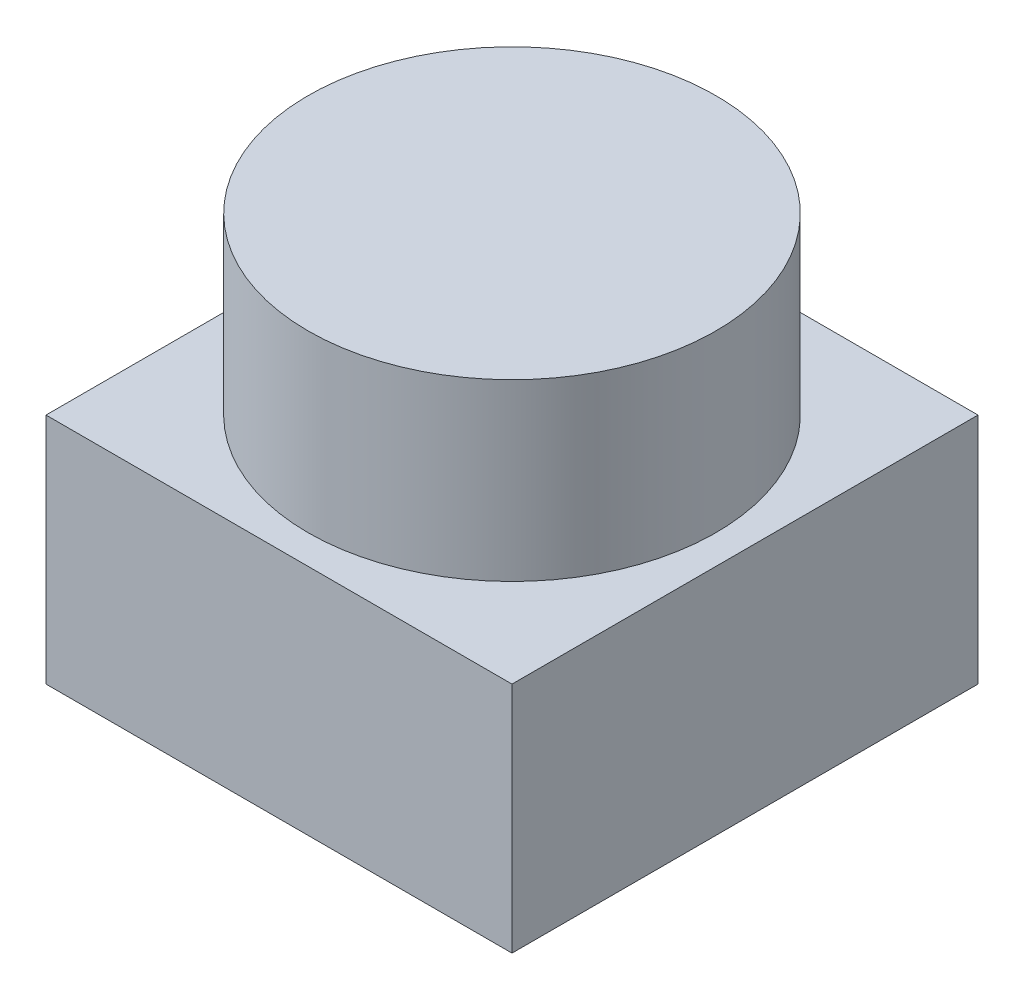
ISO-10303-21;
HEADER;
FILE_DESCRIPTION(('STEP AP214'),'2;1');
FILE_NAME('part.step','',(''),(''),'','','');
FILE_SCHEMA(('AUTOMOTIVE_DESIGN { 1 0 10303 214 1 1 1 1 }'));
ENDSEC;
DATA;
#1=APPLICATION_CONTEXT('core data for automotive mechanical design processes');
#2=APPLICATION_PROTOCOL_DEFINITION('international standard','automotive_design',2000,#1);
#3=PRODUCT_CONTEXT('',#1,'mechanical');
#4=PRODUCT('Part','Part','',(#3));
#5=PRODUCT_RELATED_PRODUCT_CATEGORY('part','',(#4));
#6=PRODUCT_DEFINITION_FORMATION('','',#4);
#7=PRODUCT_DEFINITION_CONTEXT('part definition',#1,'design');
#8=PRODUCT_DEFINITION('design','',#6,#7);
#9=PRODUCT_DEFINITION_SHAPE('','',#8);
#10=(LENGTH_UNIT() NAMED_UNIT(*) SI_UNIT(.MILLI.,.METRE.));
#11=(NAMED_UNIT(*) PLANE_ANGLE_UNIT() SI_UNIT($,.RADIAN.));
#12=(NAMED_UNIT(*) SI_UNIT($,.STERADIAN.) SOLID_ANGLE_UNIT());
#13=UNCERTAINTY_MEASURE_WITH_UNIT(LENGTH_MEASURE(1.E-05),#10,'distance_accuracy_value','');
#14=(GEOMETRIC_REPRESENTATION_CONTEXT(3) GLOBAL_UNCERTAINTY_ASSIGNED_CONTEXT((#13)) GLOBAL_UNIT_ASSIGNED_CONTEXT((#10,
#11,#12)) REPRESENTATION_CONTEXT('',''));
#15=CARTESIAN_POINT('',(0.,0.,0.));
#16=DIRECTION('',(0.,0.,1.));
#17=DIRECTION('',(1.,0.,0.));
#18=AXIS2_PLACEMENT_3D('',#15,#16,#17);
#19=CARTESIAN_POINT('',(-17.9816513761468,20.,-22.2018348623852));
#20=DIRECTION('',(1.,0.,0.));
#21=DIRECTION('',(0.,0.,-1.));
#22=AXIS2_PLACEMENT_3D('',#19,#20,#21);
#23=PLANE('',#22);
#24=DIRECTION('',(0.,0.,1.));
#25=VECTOR('',#24,1.);
#26=CARTESIAN_POINT('',(-17.9816513761468,0.,-22.2018348623852));
#27=LINE('',#26,#25);
#28=CARTESIAN_POINT('',(-17.9816513761468,0.,-22.2018348623852));
#29=VERTEX_POINT('',#28);
#30=CARTESIAN_POINT('',(-17.9816513761468,0.,17.7981651376148));
#31=VERTEX_POINT('',#30);
#32=EDGE_CURVE('E109',#29,#31,#27,.T.);
#33=ORIENTED_EDGE('',*,*,#32,.T.);
#34=DIRECTION('',(0.,-1.,0.));
#35=VECTOR('',#34,1.);
#36=CARTESIAN_POINT('',(-17.9816513761468,20.,17.7981651376148));
#37=LINE('',#36,#35);
#38=CARTESIAN_POINT('',(-17.9816513761468,20.,17.7981651376148));
#39=VERTEX_POINT('',#38);
#40=EDGE_CURVE('E46',#39,#31,#37,.T.);
#41=ORIENTED_EDGE('',*,*,#40,.F.);
#42=DIRECTION('',(0.,0.,1.));
#43=VECTOR('',#42,1.);
#44=CARTESIAN_POINT('',(-17.9816513761468,20.,-22.2018348623852));
#45=LINE('',#44,#43);
#46=CARTESIAN_POINT('',(-17.9816513761468,20.,-22.2018348623852));
#47=VERTEX_POINT('',#46);
#48=EDGE_CURVE('E96',#47,#39,#45,.T.);
#49=ORIENTED_EDGE('',*,*,#48,.F.);
#50=DIRECTION('',(0.,-1.,0.));
#51=VECTOR('',#50,1.);
#52=CARTESIAN_POINT('',(-17.9816513761468,20.,-22.2018348623852));
#53=LINE('',#52,#51);
#54=EDGE_CURVE('E105',#47,#29,#53,.T.);
#55=ORIENTED_EDGE('',*,*,#54,.T.);
#56=EDGE_LOOP('',(#33,#41,#49,#55));
#57=FACE_BOUND('',#56,.T.);
#58=ADVANCED_FACE('F43',(#57),#23,.F.);
#59=CARTESIAN_POINT('',(-17.9816513761468,20.,17.7981651376148));
#60=DIRECTION('',(0.,0.,-1.));
#61=DIRECTION('',(-1.,0.,0.));
#62=AXIS2_PLACEMENT_3D('',#59,#60,#61);
#63=PLANE('',#62);
#64=DIRECTION('',(1.,0.,0.));
#65=VECTOR('',#64,1.);
#66=CARTESIAN_POINT('',(-17.9816513761468,0.,17.7981651376148));
#67=LINE('',#66,#65);
#68=CARTESIAN_POINT('',(22.0183486238532,0.,17.7981651376148));
#69=VERTEX_POINT('',#68);
#70=EDGE_CURVE('E101',#31,#69,#67,.T.);
#71=ORIENTED_EDGE('',*,*,#70,.T.);
#72=DIRECTION('',(0.,-1.,0.));
#73=VECTOR('',#72,1.);
#74=CARTESIAN_POINT('',(22.0183486238532,20.,17.7981651376148));
#75=LINE('',#74,#73);
#76=CARTESIAN_POINT('',(22.0183486238532,20.,17.7981651376148));
#77=VERTEX_POINT('',#76);
#78=EDGE_CURVE('E99',#77,#69,#75,.T.);
#79=ORIENTED_EDGE('',*,*,#78,.F.);
#80=DIRECTION('',(1.,0.,0.));
#81=VECTOR('',#80,1.);
#82=CARTESIAN_POINT('',(-17.9816513761468,20.,17.7981651376148));
#83=LINE('',#82,#81);
#84=EDGE_CURVE('E91',#39,#77,#83,.T.);
#85=ORIENTED_EDGE('',*,*,#84,.F.);
#86=ORIENTED_EDGE('',*,*,#40,.T.);
#87=EDGE_LOOP('',(#71,#79,#85,#86));
#88=FACE_BOUND('',#87,.T.);
#89=ADVANCED_FACE('F100',(#88),#63,.F.);
#90=CARTESIAN_POINT('',(22.0183486238532,20.,-22.2018348623852));
#91=DIRECTION('',(-1.,0.,0.));
#92=DIRECTION('',(0.,0.,1.));
#93=AXIS2_PLACEMENT_3D('',#90,#91,#92);
#94=PLANE('',#93);
#95=DIRECTION('',(0.,0.,-1.));
#96=VECTOR('',#95,1.);
#97=CARTESIAN_POINT('',(22.0183486238532,0.,-22.2018348623852));
#98=LINE('',#97,#96);
#99=CARTESIAN_POINT('',(22.0183486238532,0.,-22.2018348623852));
#100=VERTEX_POINT('',#99);
#101=EDGE_CURVE('E77',#69,#100,#98,.T.);
#102=ORIENTED_EDGE('',*,*,#101,.T.);
#103=DIRECTION('',(0.,-1.,0.));
#104=VECTOR('',#103,1.);
#105=CARTESIAN_POINT('',(22.0183486238532,20.,-22.2018348623852));
#106=LINE('',#105,#104);
#107=CARTESIAN_POINT('',(22.0183486238532,20.,-22.2018348623852));
#108=VERTEX_POINT('',#107);
#109=EDGE_CURVE('E102',#108,#100,#106,.T.);
#110=ORIENTED_EDGE('',*,*,#109,.F.);
#111=DIRECTION('',(0.,0.,-1.));
#112=VECTOR('',#111,1.);
#113=CARTESIAN_POINT('',(22.0183486238532,20.,-22.2018348623852));
#114=LINE('',#113,#112);
#115=EDGE_CURVE('E94',#77,#108,#114,.T.);
#116=ORIENTED_EDGE('',*,*,#115,.F.);
#117=ORIENTED_EDGE('',*,*,#78,.T.);
#118=EDGE_LOOP('',(#102,#110,#116,#117));
#119=FACE_BOUND('',#118,.T.);
#120=ADVANCED_FACE('F103',(#119),#94,.F.);
#121=CARTESIAN_POINT('',(-17.9816513761468,20.,-22.2018348623852));
#122=DIRECTION('',(0.,0.,1.));
#123=DIRECTION('',(1.,0.,0.));
#124=AXIS2_PLACEMENT_3D('',#121,#122,#123);
#125=PLANE('',#124);
#126=DIRECTION('',(-1.,0.,0.));
#127=VECTOR('',#126,1.);
#128=CARTESIAN_POINT('',(-17.9816513761468,0.,-22.2018348623852));
#129=LINE('',#128,#127);
#130=EDGE_CURVE('E83',#100,#29,#129,.T.);
#131=ORIENTED_EDGE('',*,*,#130,.T.);
#132=ORIENTED_EDGE('',*,*,#54,.F.);
#133=DIRECTION('',(-1.,0.,0.));
#134=VECTOR('',#133,1.);
#135=CARTESIAN_POINT('',(-17.9816513761468,20.,-22.2018348623852));
#136=LINE('',#135,#134);
#137=EDGE_CURVE('E60',#108,#47,#136,.T.);
#138=ORIENTED_EDGE('',*,*,#137,.F.);
#139=ORIENTED_EDGE('',*,*,#109,.T.);
#140=EDGE_LOOP('',(#131,#132,#138,#139));
#141=FACE_BOUND('',#140,.T.);
#142=ADVANCED_FACE('F117',(#141),#125,.F.);
#143=CARTESIAN_POINT('',(0.,20.,0.));
#144=DIRECTION('',(0.,1.,0.));
#145=DIRECTION('',(0.,0.,1.));
#146=AXIS2_PLACEMENT_3D('',#143,#144,#145);
#147=PLANE('',#146);
#148=CARTESIAN_POINT('',(2.01834862385319,20.,-2.2018348623852));
#149=DIRECTION('',(0.,1.,0.));
#150=DIRECTION('',(0.,0.,1.));
#151=AXIS2_PLACEMENT_3D('',#148,#149,#150);
#152=CIRCLE('',#151,17.5);
#153=CARTESIAN_POINT('',(2.01834862385319,20.,15.2981651376148));
#154=VERTEX_POINT('',#153);
#155=EDGE_CURVE('E11',#154,#154,#152,.T.);
#156=ORIENTED_EDGE('',*,*,#155,.F.);
#157=EDGE_LOOP('',(#156));
#158=FACE_BOUND('',#157,.T.);
#159=ORIENTED_EDGE('',*,*,#48,.T.);
#160=ORIENTED_EDGE('',*,*,#84,.T.);
#161=ORIENTED_EDGE('',*,*,#115,.T.);
#162=ORIENTED_EDGE('',*,*,#137,.T.);
#163=EDGE_LOOP('',(#159,#160,#161,#162));
#164=FACE_BOUND('',#163,.T.);
#165=ADVANCED_FACE('F92',(#158,#164),#147,.T.);
#166=CARTESIAN_POINT('',(0.,0.,0.));
#167=DIRECTION('',(0.,1.,0.));
#168=DIRECTION('',(0.,0.,1.));
#169=AXIS2_PLACEMENT_3D('',#166,#167,#168);
#170=PLANE('',#169);
#171=ORIENTED_EDGE('',*,*,#32,.F.);
#172=ORIENTED_EDGE('',*,*,#130,.F.);
#173=ORIENTED_EDGE('',*,*,#101,.F.);
#174=ORIENTED_EDGE('',*,*,#70,.F.);
#175=EDGE_LOOP('',(#171,#172,#173,#174));
#176=FACE_BOUND('',#175,.T.);
#177=ADVANCED_FACE('F120',(#176),#170,.F.);
#178=CARTESIAN_POINT('',(2.01834862385319,35.,-2.2018348623852));
#179=DIRECTION('',(0.,-1.,0.));
#180=DIRECTION('',(0.,0.,-1.));
#181=AXIS2_PLACEMENT_3D('',#178,#179,#180);
#182=CYLINDRICAL_SURFACE('',#181,17.5);
#183=CARTESIAN_POINT('',(2.01834862385319,35.,-2.2018348623852));
#184=DIRECTION('',(0.,1.,0.));
#185=DIRECTION('',(0.,0.,1.));
#186=AXIS2_PLACEMENT_3D('',#183,#184,#185);
#187=CIRCLE('',#186,17.5);
#188=CARTESIAN_POINT('',(2.01834862385319,35.,15.2981651376148));
#189=VERTEX_POINT('',#188);
#190=EDGE_CURVE('E112',#189,#189,#187,.T.);
#191=ORIENTED_EDGE('',*,*,#190,.F.);
#192=EDGE_LOOP('',(#191));
#193=FACE_BOUND('',#192,.T.);
#194=ORIENTED_EDGE('',*,*,#155,.T.);
#195=EDGE_LOOP('',(#194));
#196=FACE_BOUND('',#195,.T.);
#197=ADVANCED_FACE('F128',(#193,#196),#182,.T.);
#198=CARTESIAN_POINT('',(2.01834862385319,35.,-2.2018348623852));
#199=DIRECTION('',(0.,1.,0.));
#200=DIRECTION('',(0.,0.,1.));
#201=AXIS2_PLACEMENT_3D('',#198,#199,#200);
#202=PLANE('',#201);
#203=ORIENTED_EDGE('',*,*,#190,.T.);
#204=EDGE_LOOP('',(#203));
#205=FACE_BOUND('',#204,.T.);
#206=ADVANCED_FACE('F126',(#205),#202,.T.);
#207=CLOSED_SHELL('',(#58,#89,#120,#142,#165,#177,#197,#206));
#208=MANIFOLD_SOLID_BREP('B2',#207);
#209=ADVANCED_BREP_SHAPE_REPRESENTATION('',(#18,#208),#14);
#210=SHAPE_DEFINITION_REPRESENTATION(#9,#209);
ENDSEC;
END-ISO-10303-21;
